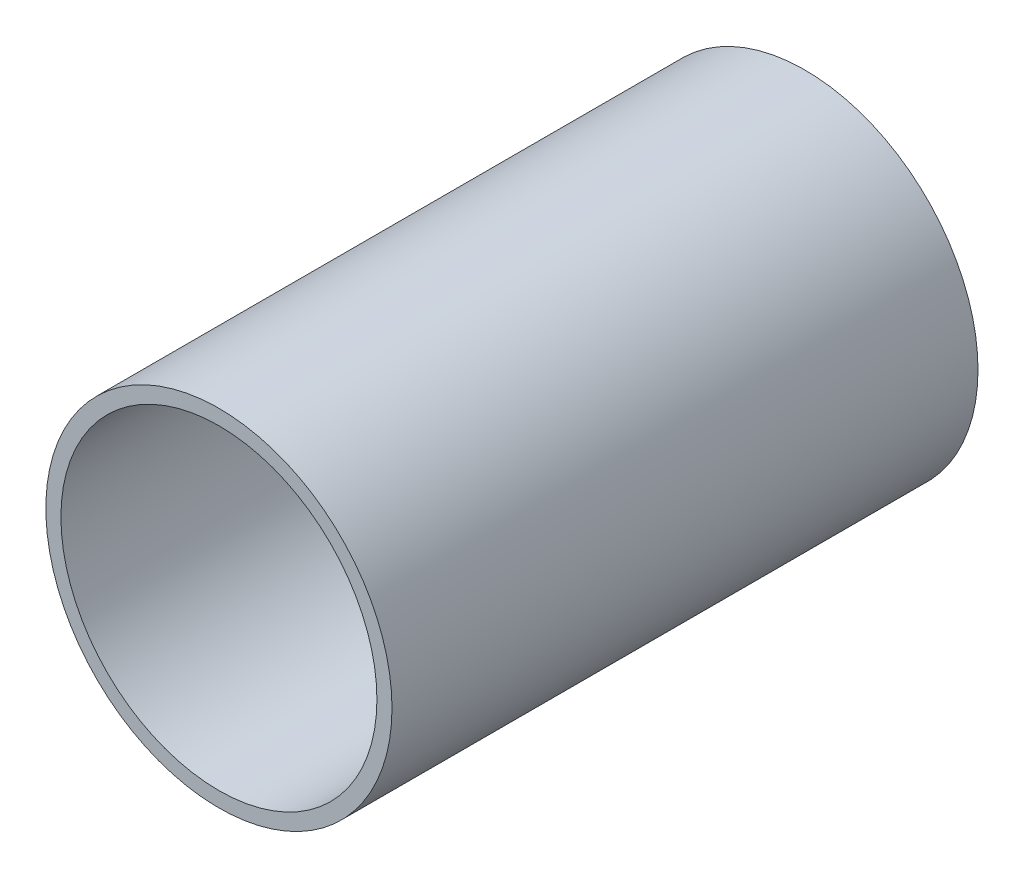
ISO-10303-21;
HEADER;
FILE_DESCRIPTION(('STEP AP214'),'2;1');
FILE_NAME('part.step','',(''),(''),'','','');
FILE_SCHEMA(('AUTOMOTIVE_DESIGN { 1 0 10303 214 1 1 1 1 }'));
ENDSEC;
DATA;
#1=APPLICATION_CONTEXT('core data for automotive mechanical design processes');
#2=APPLICATION_PROTOCOL_DEFINITION('international standard','automotive_design',2000,#1);
#3=PRODUCT_CONTEXT('',#1,'mechanical');
#4=PRODUCT('Part','Part','',(#3));
#5=PRODUCT_RELATED_PRODUCT_CATEGORY('part','',(#4));
#6=PRODUCT_DEFINITION_FORMATION('','',#4);
#7=PRODUCT_DEFINITION_CONTEXT('part definition',#1,'design');
#8=PRODUCT_DEFINITION('design','',#6,#7);
#9=PRODUCT_DEFINITION_SHAPE('','',#8);
#10=(LENGTH_UNIT() NAMED_UNIT(*) SI_UNIT(.MILLI.,.METRE.));
#11=(NAMED_UNIT(*) PLANE_ANGLE_UNIT() SI_UNIT($,.RADIAN.));
#12=(NAMED_UNIT(*) SI_UNIT($,.STERADIAN.) SOLID_ANGLE_UNIT());
#13=UNCERTAINTY_MEASURE_WITH_UNIT(LENGTH_MEASURE(1.E-05),#10,'distance_accuracy_value','');
#14=(GEOMETRIC_REPRESENTATION_CONTEXT(3) GLOBAL_UNCERTAINTY_ASSIGNED_CONTEXT((#13)) GLOBAL_UNIT_ASSIGNED_CONTEXT((#10,
#11,#12)) REPRESENTATION_CONTEXT('',''));
#15=CARTESIAN_POINT('',(0.,0.,0.));
#16=DIRECTION('',(0.,0.,1.));
#17=DIRECTION('',(1.,0.,0.));
#18=AXIS2_PLACEMENT_3D('',#15,#16,#17);
#19=CARTESIAN_POINT('',(-54.4068797322574,32.341546364894,39.5));
#20=DIRECTION('',(0.,0.,1.));
#21=DIRECTION('',(1.,0.,0.));
#22=AXIS2_PLACEMENT_3D('',#19,#20,#21);
#23=PLANE('',#22);
#24=CARTESIAN_POINT('',(-54.4068797322574,32.341546364894,39.5));
#25=DIRECTION('',(0.,0.,1.));
#26=DIRECTION('',(1.,0.,0.));
#27=AXIS2_PLACEMENT_3D('',#24,#25,#26);
#28=CIRCLE('',#27,11.6660000000001);
#29=CARTESIAN_POINT('',(-42.7408797322573,32.341546364894,39.5));
#30=VERTEX_POINT('',#29);
#31=EDGE_CURVE('E10',#30,#30,#28,.T.);
#32=ORIENTED_EDGE('',*,*,#31,.T.);
#33=EDGE_LOOP('',(#32));
#34=FACE_BOUND('',#33,.T.);
#35=CARTESIAN_POINT('',(-54.4068797322574,32.341546364894,39.5));
#36=DIRECTION('',(0.,0.,1.));
#37=DIRECTION('',(1.,0.,0.));
#38=AXIS2_PLACEMENT_3D('',#35,#36,#37);
#39=CIRCLE('',#38,10.6500000000001);
#40=CARTESIAN_POINT('',(-43.7568797322573,32.341546364894,39.5));
#41=VERTEX_POINT('',#40);
#42=EDGE_CURVE('E41',#41,#41,#39,.T.);
#43=ORIENTED_EDGE('',*,*,#42,.F.);
#44=EDGE_LOOP('',(#43));
#45=FACE_BOUND('',#44,.T.);
#46=ADVANCED_FACE('F30',(#34,#45),#23,.T.);
#47=CARTESIAN_POINT('',(-54.4068797322574,32.341546364894,0.));
#48=DIRECTION('',(0.,0.,1.));
#49=DIRECTION('',(1.,0.,0.));
#50=AXIS2_PLACEMENT_3D('',#47,#48,#49);
#51=PLANE('',#50);
#52=CARTESIAN_POINT('',(-54.4068797322574,32.341546364894,0.));
#53=DIRECTION('',(0.,0.,1.));
#54=DIRECTION('',(1.,0.,0.));
#55=AXIS2_PLACEMENT_3D('',#52,#53,#54);
#56=CIRCLE('',#55,11.6660000000001);
#57=CARTESIAN_POINT('',(-42.7408797322573,32.341546364894,0.));
#58=VERTEX_POINT('',#57);
#59=EDGE_CURVE('E34',#58,#58,#56,.T.);
#60=ORIENTED_EDGE('',*,*,#59,.F.);
#61=EDGE_LOOP('',(#60));
#62=FACE_BOUND('',#61,.T.);
#63=CARTESIAN_POINT('',(-54.4068797322574,32.341546364894,0.));
#64=DIRECTION('',(0.,0.,1.));
#65=DIRECTION('',(1.,0.,0.));
#66=AXIS2_PLACEMENT_3D('',#63,#64,#65);
#67=CIRCLE('',#66,10.6500000000001);
#68=CARTESIAN_POINT('',(-43.7568797322573,32.341546364894,0.));
#69=VERTEX_POINT('',#68);
#70=EDGE_CURVE('E43',#69,#69,#67,.T.);
#71=ORIENTED_EDGE('',*,*,#70,.T.);
#72=EDGE_LOOP('',(#71));
#73=FACE_BOUND('',#72,.T.);
#74=ADVANCED_FACE('F53',(#62,#73),#51,.F.);
#75=CARTESIAN_POINT('',(-54.4068797322574,32.341546364894,39.5));
#76=DIRECTION('',(0.,0.,-1.));
#77=DIRECTION('',(-1.,0.,0.));
#78=AXIS2_PLACEMENT_3D('',#75,#76,#77);
#79=CYLINDRICAL_SURFACE('',#78,11.6660000000001);
#80=ORIENTED_EDGE('',*,*,#31,.F.);
#81=EDGE_LOOP('',(#80));
#82=FACE_BOUND('',#81,.T.);
#83=ORIENTED_EDGE('',*,*,#59,.T.);
#84=EDGE_LOOP('',(#83));
#85=FACE_BOUND('',#84,.T.);
#86=ADVANCED_FACE('F32',(#82,#85),#79,.T.);
#87=CARTESIAN_POINT('',(-54.4068797322574,32.341546364894,39.5));
#88=DIRECTION('',(0.,0.,-1.));
#89=DIRECTION('',(-1.,0.,0.));
#90=AXIS2_PLACEMENT_3D('',#87,#88,#89);
#91=CYLINDRICAL_SURFACE('',#90,10.6500000000001);
#92=ORIENTED_EDGE('',*,*,#42,.T.);
#93=EDGE_LOOP('',(#92));
#94=FACE_BOUND('',#93,.T.);
#95=ORIENTED_EDGE('',*,*,#70,.F.);
#96=EDGE_LOOP('',(#95));
#97=FACE_BOUND('',#96,.T.);
#98=ADVANCED_FACE('F49',(#94,#97),#91,.F.);
#99=CLOSED_SHELL('',(#46,#74,#86,#98));
#100=MANIFOLD_SOLID_BREP('B2',#99);
#101=ADVANCED_BREP_SHAPE_REPRESENTATION('',(#18,#100),#14);
#102=SHAPE_DEFINITION_REPRESENTATION(#9,#101);
ENDSEC;
END-ISO-10303-21;
